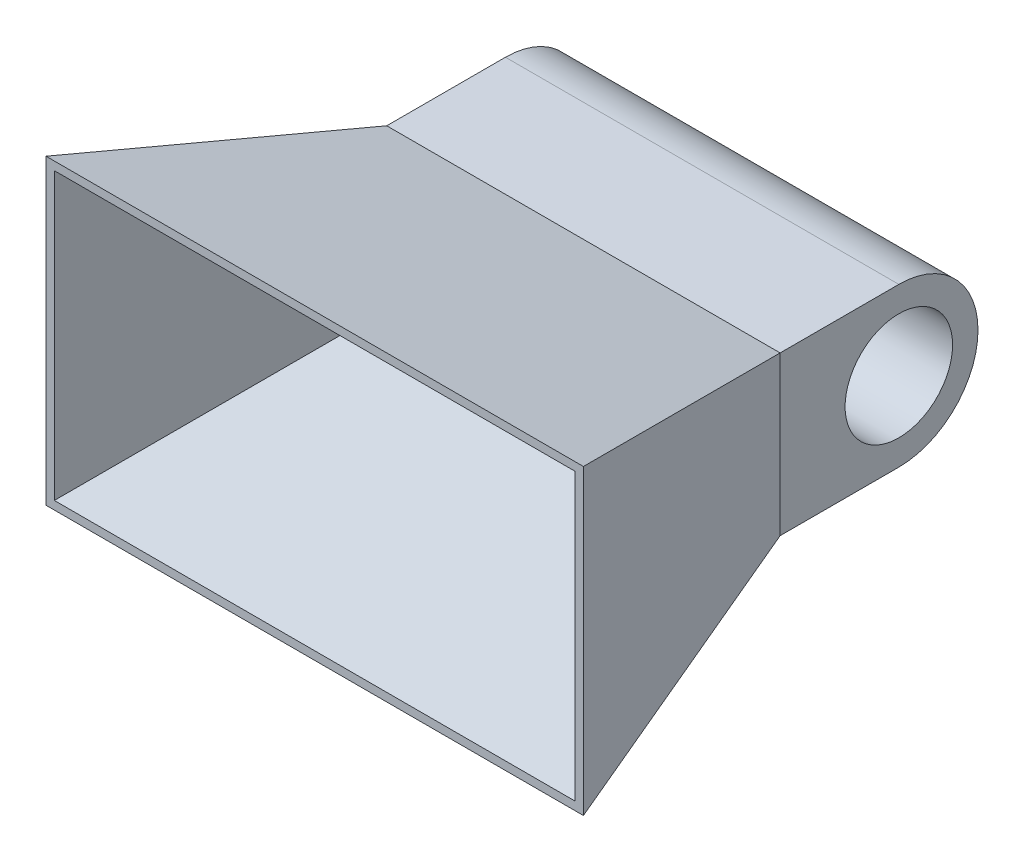
ISO-10303-21;
HEADER;
FILE_DESCRIPTION(('STEP AP214'),'2;1');
FILE_NAME('part.step','',(''),(''),'','','');
FILE_SCHEMA(('AUTOMOTIVE_DESIGN { 1 0 10303 214 1 1 1 1 }'));
ENDSEC;
DATA;
#1=APPLICATION_CONTEXT('core data for automotive mechanical design processes');
#2=APPLICATION_PROTOCOL_DEFINITION('international standard','automotive_design',2000,#1);
#3=PRODUCT_CONTEXT('',#1,'mechanical');
#4=PRODUCT('Part','Part','',(#3));
#5=PRODUCT_RELATED_PRODUCT_CATEGORY('part','',(#4));
#6=PRODUCT_DEFINITION_FORMATION('','',#4);
#7=PRODUCT_DEFINITION_CONTEXT('part definition',#1,'design');
#8=PRODUCT_DEFINITION('design','',#6,#7);
#9=PRODUCT_DEFINITION_SHAPE('','',#8);
#10=(LENGTH_UNIT() NAMED_UNIT(*) SI_UNIT(.MILLI.,.METRE.));
#11=(NAMED_UNIT(*) PLANE_ANGLE_UNIT() SI_UNIT($,.RADIAN.));
#12=(NAMED_UNIT(*) SI_UNIT($,.STERADIAN.) SOLID_ANGLE_UNIT());
#13=UNCERTAINTY_MEASURE_WITH_UNIT(LENGTH_MEASURE(1.E-05),#10,'distance_accuracy_value','');
#14=(GEOMETRIC_REPRESENTATION_CONTEXT(3) GLOBAL_UNCERTAINTY_ASSIGNED_CONTEXT((#13)) GLOBAL_UNIT_ASSIGNED_CONTEXT((#10,
#11,#12)) REPRESENTATION_CONTEXT('',''));
#15=CARTESIAN_POINT('',(0.,0.,0.));
#16=DIRECTION('',(0.,0.,1.));
#17=DIRECTION('',(1.,0.,0.));
#18=AXIS2_PLACEMENT_3D('',#15,#16,#17);
#19=CARTESIAN_POINT('',(100.,56.25,0.));
#20=DIRECTION('',(0.965925826289068,0.,-0.258819045102521));
#21=DIRECTION('',(-0.258819045102521,0.,-0.965925826289068));
#22=AXIS2_PLACEMENT_3D('',#19,#20,#21);
#23=PLANE('',#22);
#24=DIRECTION('',(0.,1.,0.));
#25=VECTOR('',#24,1.);
#26=CARTESIAN_POINT('',(100.,56.25,0.));
#27=LINE('',#26,#25);
#28=CARTESIAN_POINT('',(100.,-56.25,0.));
#29=VERTEX_POINT('',#28);
#30=CARTESIAN_POINT('',(100.,56.25,0.));
#31=VERTEX_POINT('',#30);
#32=EDGE_CURVE('E147',#29,#31,#27,.T.);
#33=ORIENTED_EDGE('',*,*,#32,.F.);
#34=DIRECTION('',(0.250562807085732,-0.250562807085732,0.935113126531029));
#35=VECTOR('',#34,1.);
#36=CARTESIAN_POINT('',(87.4436559410637,-43.6936559410636,-46.860913985266));
#37=LINE('',#36,#35);
#38=CARTESIAN_POINT('',(73.2050807568877,-29.4550807568877,-100.));
#39=VERTEX_POINT('',#38);
#40=EDGE_CURVE('E11',#39,#29,#37,.T.);
#41=ORIENTED_EDGE('',*,*,#40,.F.);
#42=DIRECTION('',(0.,1.,0.));
#43=VECTOR('',#42,1.);
#44=CARTESIAN_POINT('',(73.2050807568877,0.,-100.));
#45=LINE('',#44,#43);
#46=CARTESIAN_POINT('',(73.2050807568877,29.4550807568877,-100.));
#47=VERTEX_POINT('',#46);
#48=EDGE_CURVE('E185',#39,#47,#45,.T.);
#49=ORIENTED_EDGE('',*,*,#48,.T.);
#50=DIRECTION('',(0.250562807085732,0.250562807085732,0.935113126531029));
#51=VECTOR('',#50,1.);
#52=CARTESIAN_POINT('',(100.,56.25,0.));
#53=LINE('',#52,#51);
#54=EDGE_CURVE('E187',#47,#31,#53,.T.);
#55=ORIENTED_EDGE('',*,*,#54,.T.);
#56=EDGE_LOOP('',(#33,#41,#49,#55));
#57=FACE_BOUND('',#56,.T.);
#58=ADVANCED_FACE('F36',(#57),#23,.T.);
#59=CARTESIAN_POINT('',(-100.,-56.25,0.));
#60=DIRECTION('',(0.,-0.965925826289068,-0.258819045102521));
#61=DIRECTION('',(0.,0.258819045102521,-0.965925826289068));
#62=AXIS2_PLACEMENT_3D('',#59,#60,#61);
#63=PLANE('',#62);
#64=DIRECTION('',(1.,0.,0.));
#65=VECTOR('',#64,1.);
#66=CARTESIAN_POINT('',(-100.,-56.25,0.));
#67=LINE('',#66,#65);
#68=CARTESIAN_POINT('',(-100.,-56.25,0.));
#69=VERTEX_POINT('',#68);
#70=EDGE_CURVE('E183',#69,#29,#67,.T.);
#71=ORIENTED_EDGE('',*,*,#70,.F.);
#72=DIRECTION('',(-0.250562807085732,-0.250562807085732,0.935113126531029));
#73=VECTOR('',#72,1.);
#74=CARTESIAN_POINT('',(-92.9370564668483,-49.1870564668483,-26.3592641167121));
#75=LINE('',#74,#73);
#76=CARTESIAN_POINT('',(-73.2050807568877,-29.4550807568877,-100.));
#77=VERTEX_POINT('',#76);
#78=EDGE_CURVE('E45',#77,#69,#75,.T.);
#79=ORIENTED_EDGE('',*,*,#78,.F.);
#80=DIRECTION('',(1.,0.,0.));
#81=VECTOR('',#80,1.);
#82=CARTESIAN_POINT('',(0.,-29.4550807568877,-100.));
#83=LINE('',#82,#81);
#84=EDGE_CURVE('E132',#77,#39,#83,.T.);
#85=ORIENTED_EDGE('',*,*,#84,.T.);
#86=ORIENTED_EDGE('',*,*,#40,.T.);
#87=EDGE_LOOP('',(#71,#79,#85,#86));
#88=FACE_BOUND('',#87,.T.);
#89=ADVANCED_FACE('F38',(#88),#63,.T.);
#90=CARTESIAN_POINT('',(-100.,56.25,0.));
#91=DIRECTION('',(-0.965925826289068,0.,-0.258819045102521));
#92=DIRECTION('',(-0.258819045102521,0.,0.965925826289068));
#93=AXIS2_PLACEMENT_3D('',#90,#91,#92);
#94=PLANE('',#93);
#95=DIRECTION('',(0.,-1.,0.));
#96=VECTOR('',#95,1.);
#97=CARTESIAN_POINT('',(-100.,56.25,0.));
#98=LINE('',#97,#96);
#99=CARTESIAN_POINT('',(-100.,56.25,0.));
#100=VERTEX_POINT('',#99);
#101=EDGE_CURVE('E180',#100,#69,#98,.T.);
#102=ORIENTED_EDGE('',*,*,#101,.F.);
#103=DIRECTION('',(-0.250562807085732,0.250562807085732,0.935113126531029));
#104=VECTOR('',#103,1.);
#105=CARTESIAN_POINT('',(-100.,56.25,0.));
#106=LINE('',#105,#104);
#107=CARTESIAN_POINT('',(-73.2050807568877,29.4550807568877,-100.));
#108=VERTEX_POINT('',#107);
#109=EDGE_CURVE('E189',#108,#100,#106,.T.);
#110=ORIENTED_EDGE('',*,*,#109,.F.);
#111=DIRECTION('',(0.,-1.,0.));
#112=VECTOR('',#111,1.);
#113=CARTESIAN_POINT('',(-73.2050807568877,0.,-100.));
#114=LINE('',#113,#112);
#115=EDGE_CURVE('E194',#108,#77,#114,.T.);
#116=ORIENTED_EDGE('',*,*,#115,.T.);
#117=ORIENTED_EDGE('',*,*,#78,.T.);
#118=EDGE_LOOP('',(#102,#110,#116,#117));
#119=FACE_BOUND('',#118,.T.);
#120=ADVANCED_FACE('F239',(#119),#94,.T.);
#121=CARTESIAN_POINT('',(-100.,56.25,0.));
#122=DIRECTION('',(0.,0.965925826289068,-0.258819045102521));
#123=DIRECTION('',(0.,0.258819045102521,0.965925826289068));
#124=AXIS2_PLACEMENT_3D('',#121,#122,#123);
#125=PLANE('',#124);
#126=DIRECTION('',(-1.,0.,0.));
#127=VECTOR('',#126,1.);
#128=CARTESIAN_POINT('',(-100.,56.25,0.));
#129=LINE('',#128,#127);
#130=EDGE_CURVE('E177',#31,#100,#129,.T.);
#131=ORIENTED_EDGE('',*,*,#130,.F.);
#132=ORIENTED_EDGE('',*,*,#54,.F.);
#133=DIRECTION('',(-1.,0.,0.));
#134=VECTOR('',#133,1.);
#135=CARTESIAN_POINT('',(0.,29.4550807568877,-100.));
#136=LINE('',#135,#134);
#137=EDGE_CURVE('E40',#47,#108,#136,.T.);
#138=ORIENTED_EDGE('',*,*,#137,.T.);
#139=ORIENTED_EDGE('',*,*,#109,.T.);
#140=EDGE_LOOP('',(#131,#132,#138,#139));
#141=FACE_BOUND('',#140,.T.);
#142=ADVANCED_FACE('F202',(#141),#125,.T.);
#143=CARTESIAN_POINT('',(0.,0.,0.));
#144=DIRECTION('',(0.,0.,1.));
#145=DIRECTION('',(1.,0.,0.));
#146=AXIS2_PLACEMENT_3D('',#143,#144,#145);
#147=PLANE('',#146);
#148=DIRECTION('',(0.,1.,0.));
#149=VECTOR('',#148,1.);
#150=CARTESIAN_POINT('',(96.8941714587698,0.,0.));
#151=LINE('',#150,#149);
#152=CARTESIAN_POINT('',(96.8941714587698,-53.1441714587698,0.));
#153=VERTEX_POINT('',#152);
#154=CARTESIAN_POINT('',(96.8941714587697,53.1441714587697,0.));
#155=VERTEX_POINT('',#154);
#156=EDGE_CURVE('E142',#153,#155,#151,.T.);
#157=ORIENTED_EDGE('',*,*,#156,.F.);
#158=DIRECTION('',(1.,0.,0.));
#159=VECTOR('',#158,1.);
#160=CARTESIAN_POINT('',(0.,-53.1441714587698,0.));
#161=LINE('',#160,#159);
#162=CARTESIAN_POINT('',(-96.8941714587698,-53.1441714587698,0.));
#163=VERTEX_POINT('',#162);
#164=EDGE_CURVE('E153',#163,#153,#161,.T.);
#165=ORIENTED_EDGE('',*,*,#164,.F.);
#166=DIRECTION('',(0.,-1.,0.));
#167=VECTOR('',#166,1.);
#168=CARTESIAN_POINT('',(-96.8941714587698,0.,0.));
#169=LINE('',#168,#167);
#170=CARTESIAN_POINT('',(-96.8941714587698,53.1441714587697,0.));
#171=VERTEX_POINT('',#170);
#172=EDGE_CURVE('E53',#171,#163,#169,.T.);
#173=ORIENTED_EDGE('',*,*,#172,.F.);
#174=DIRECTION('',(-1.,0.,0.));
#175=VECTOR('',#174,1.);
#176=CARTESIAN_POINT('',(0.,53.1441714587697,0.));
#177=LINE('',#176,#175);
#178=EDGE_CURVE('E169',#155,#171,#177,.T.);
#179=ORIENTED_EDGE('',*,*,#178,.F.);
#180=EDGE_LOOP('',(#157,#165,#173,#179));
#181=FACE_BOUND('',#180,.T.);
#182=ORIENTED_EDGE('',*,*,#32,.T.);
#183=ORIENTED_EDGE('',*,*,#130,.T.);
#184=ORIENTED_EDGE('',*,*,#101,.T.);
#185=ORIENTED_EDGE('',*,*,#70,.T.);
#186=EDGE_LOOP('',(#182,#183,#184,#185));
#187=FACE_BOUND('',#186,.T.);
#188=ADVANCED_FACE('F244',(#181,#187),#147,.T.);
#189=CARTESIAN_POINT('',(97.1022225211328,56.25,0.776457135307564));
#190=DIRECTION('',(0.965925826289068,0.,-0.258819045102521));
#191=DIRECTION('',(-0.258819045102521,0.,-0.965925826289068));
#192=AXIS2_PLACEMENT_3D('',#189,#190,#191);
#193=PLANE('',#192);
#194=ORIENTED_EDGE('',*,*,#156,.T.);
#195=DIRECTION('',(0.250562807085732,0.250562807085732,0.935113126531029));
#196=VECTOR('',#195,1.);
#197=CARTESIAN_POINT('',(97.2841499762873,53.5341499762873,1.45541964123575));
#198=LINE('',#197,#196);
#199=CARTESIAN_POINT('',(70.9030997929508,27.1530997929508,-97.));
#200=VERTEX_POINT('',#199);
#201=EDGE_CURVE('E154',#200,#155,#198,.T.);
#202=ORIENTED_EDGE('',*,*,#201,.F.);
#203=DIRECTION('',(0.,1.,0.));
#204=VECTOR('',#203,1.);
#205=CARTESIAN_POINT('',(70.9030997929508,0.,-97.));
#206=LINE('',#205,#204);
#207=CARTESIAN_POINT('',(70.9030997929508,-27.1530997929508,-97.));
#208=VERTEX_POINT('',#207);
#209=EDGE_CURVE('E149',#208,#200,#206,.T.);
#210=ORIENTED_EDGE('',*,*,#209,.F.);
#211=DIRECTION('',(0.250562807085732,-0.250562807085732,0.935113126531029));
#212=VECTOR('',#211,1.);
#213=CARTESIAN_POINT('',(84.7278059173509,-40.9778059173509,-45.4054943440303));
#214=LINE('',#213,#212);
#215=EDGE_CURVE('E145',#208,#153,#214,.T.);
#216=ORIENTED_EDGE('',*,*,#215,.T.);
#217=EDGE_LOOP('',(#194,#202,#210,#216));
#218=FACE_BOUND('',#217,.T.);
#219=ADVANCED_FACE('F253',(#218),#193,.F.);
#220=CARTESIAN_POINT('',(-100.,-53.3522225211328,0.776457135307564));
#221=DIRECTION('',(0.,-0.965925826289068,-0.258819045102521));
#222=DIRECTION('',(0.,0.258819045102521,-0.965925826289068));
#223=AXIS2_PLACEMENT_3D('',#220,#221,#222);
#224=PLANE('',#223);
#225=ORIENTED_EDGE('',*,*,#164,.T.);
#226=ORIENTED_EDGE('',*,*,#215,.F.);
#227=DIRECTION('',(1.,0.,0.));
#228=VECTOR('',#227,1.);
#229=CARTESIAN_POINT('',(0.,-27.1530997929508,-97.));
#230=LINE('',#229,#228);
#231=CARTESIAN_POINT('',(-70.9030997929508,-27.1530997929508,-97.));
#232=VERTEX_POINT('',#231);
#233=EDGE_CURVE('E157',#232,#208,#230,.T.);
#234=ORIENTED_EDGE('',*,*,#233,.F.);
#235=DIRECTION('',(-0.250562807085732,-0.250562807085732,0.935113126531029));
#236=VECTOR('',#235,1.);
#237=CARTESIAN_POINT('',(-90.2212064431356,-46.4712064431356,-24.9038444754764));
#238=LINE('',#237,#236);
#239=EDGE_CURVE('E148',#232,#163,#238,.T.);
#240=ORIENTED_EDGE('',*,*,#239,.T.);
#241=EDGE_LOOP('',(#225,#226,#234,#240));
#242=FACE_BOUND('',#241,.T.);
#243=ADVANCED_FACE('F258',(#242),#224,.F.);
#244=CARTESIAN_POINT('',(-97.1022225211328,56.25,0.776457135307564));
#245=DIRECTION('',(-0.965925826289068,0.,-0.258819045102521));
#246=DIRECTION('',(-0.258819045102521,0.,0.965925826289068));
#247=AXIS2_PLACEMENT_3D('',#244,#245,#246);
#248=PLANE('',#247);
#249=ORIENTED_EDGE('',*,*,#172,.T.);
#250=ORIENTED_EDGE('',*,*,#239,.F.);
#251=DIRECTION('',(0.,-1.,0.));
#252=VECTOR('',#251,1.);
#253=CARTESIAN_POINT('',(-70.9030997929508,0.,-97.));
#254=LINE('',#253,#252);
#255=CARTESIAN_POINT('',(-70.9030997929508,27.1530997929508,-97.));
#256=VERTEX_POINT('',#255);
#257=EDGE_CURVE('E161',#256,#232,#254,.T.);
#258=ORIENTED_EDGE('',*,*,#257,.F.);
#259=DIRECTION('',(-0.250562807085732,0.250562807085732,0.935113126531029));
#260=VECTOR('',#259,1.);
#261=CARTESIAN_POINT('',(-97.2841499762873,53.5341499762873,1.45541964123575));
#262=LINE('',#261,#260);
#263=EDGE_CURVE('E156',#256,#171,#262,.T.);
#264=ORIENTED_EDGE('',*,*,#263,.T.);
#265=EDGE_LOOP('',(#249,#250,#258,#264));
#266=FACE_BOUND('',#265,.T.);
#267=ADVANCED_FACE('F269',(#266),#248,.F.);
#268=CARTESIAN_POINT('',(-100.,53.3522225211328,0.776457135307564));
#269=DIRECTION('',(0.,0.965925826289068,-0.258819045102521));
#270=DIRECTION('',(0.,0.258819045102521,0.965925826289068));
#271=AXIS2_PLACEMENT_3D('',#268,#269,#270);
#272=PLANE('',#271);
#273=ORIENTED_EDGE('',*,*,#178,.T.);
#274=ORIENTED_EDGE('',*,*,#263,.F.);
#275=DIRECTION('',(-1.,0.,0.));
#276=VECTOR('',#275,1.);
#277=CARTESIAN_POINT('',(0.,27.1530997929508,-97.));
#278=LINE('',#277,#276);
#279=EDGE_CURVE('E152',#200,#256,#278,.T.);
#280=ORIENTED_EDGE('',*,*,#279,.F.);
#281=ORIENTED_EDGE('',*,*,#201,.T.);
#282=EDGE_LOOP('',(#273,#274,#280,#281));
#283=FACE_BOUND('',#282,.T.);
#284=ADVANCED_FACE('F272',(#283),#272,.F.);
#285=CARTESIAN_POINT('',(0.,0.,-97.));
#286=DIRECTION('',(0.,0.,1.));
#287=DIRECTION('',(1.,0.,0.));
#288=AXIS2_PLACEMENT_3D('',#285,#286,#287);
#289=PLANE('',#288);
#290=ORIENTED_EDGE('',*,*,#209,.T.);
#291=ORIENTED_EDGE('',*,*,#279,.T.);
#292=ORIENTED_EDGE('',*,*,#257,.T.);
#293=ORIENTED_EDGE('',*,*,#233,.T.);
#294=EDGE_LOOP('',(#290,#291,#292,#293));
#295=FACE_BOUND('',#294,.T.);
#296=ADVANCED_FACE('F228',(#295),#289,.T.);
#297=CARTESIAN_POINT('',(-73.2050807568877,0.,0.));
#298=DIRECTION('',(-1.,0.,0.));
#299=DIRECTION('',(0.,0.,1.));
#300=AXIS2_PLACEMENT_3D('',#297,#298,#299);
#301=PLANE('',#300);
#302=CARTESIAN_POINT('',(-73.2050807568877,0.,-144.182621135331));
#303=DIRECTION('',(-1.,0.,0.));
#304=DIRECTION('',(0.,0.,1.));
#305=AXIS2_PLACEMENT_3D('',#302,#303,#304);
#306=CIRCLE('',#305,20.);
#307=CARTESIAN_POINT('',(-73.2050807568877,0.,-124.182621135331));
#308=VERTEX_POINT('',#307);
#309=EDGE_CURVE('E210',#308,#308,#306,.F.);
#310=ORIENTED_EDGE('',*,*,#309,.T.);
#311=EDGE_LOOP('',(#310));
#312=FACE_BOUND('',#311,.T.);
#313=ORIENTED_EDGE('',*,*,#115,.F.);
#314=DIRECTION('',(0.,0.,1.));
#315=VECTOR('',#314,1.);
#316=CARTESIAN_POINT('',(-73.2050807568877,29.4550807568877,-100.));
#317=LINE('',#316,#315);
#318=CARTESIAN_POINT('',(-73.2050807568877,29.4550807568877,-144.182621135331));
#319=VERTEX_POINT('',#318);
#320=EDGE_CURVE('E61',#319,#108,#317,.T.);
#321=ORIENTED_EDGE('',*,*,#320,.F.);
#322=CARTESIAN_POINT('',(-73.2050807568877,0.,-144.182621135331));
#323=DIRECTION('',(-1.,0.,0.));
#324=DIRECTION('',(0.,0.,1.));
#325=AXIS2_PLACEMENT_3D('',#322,#323,#324);
#326=CIRCLE('',#325,29.4550807568877);
#327=CARTESIAN_POINT('',(-73.2050807568877,-29.4550807568877,-144.182621135331));
#328=VERTEX_POINT('',#327);
#329=EDGE_CURVE('E113',#328,#319,#326,.F.);
#330=ORIENTED_EDGE('',*,*,#329,.F.);
#331=DIRECTION('',(0.,0.,-1.));
#332=VECTOR('',#331,1.);
#333=CARTESIAN_POINT('',(-73.2050807568877,-29.4550807568877,-100.));
#334=LINE('',#333,#332);
#335=EDGE_CURVE('E117',#77,#328,#334,.T.);
#336=ORIENTED_EDGE('',*,*,#335,.F.);
#337=EDGE_LOOP('',(#313,#321,#330,#336));
#338=FACE_BOUND('',#337,.T.);
#339=ADVANCED_FACE('F115',(#312,#338),#301,.T.);
#340=CARTESIAN_POINT('',(73.2050807568877,0.,-144.182621135331));
#341=DIRECTION('',(1.,0.,0.));
#342=DIRECTION('',(0.,0.,-1.));
#343=AXIS2_PLACEMENT_3D('',#340,#341,#342);
#344=PLANE('',#343);
#345=CARTESIAN_POINT('',(73.2050807568877,0.,-144.182621135331));
#346=DIRECTION('',(1.,0.,0.));
#347=DIRECTION('',(0.,0.,-1.));
#348=AXIS2_PLACEMENT_3D('',#345,#346,#347);
#349=CIRCLE('',#348,20.);
#350=CARTESIAN_POINT('',(73.2050807568877,0.,-164.182621135331));
#351=VERTEX_POINT('',#350);
#352=EDGE_CURVE('E214',#351,#351,#349,.T.);
#353=ORIENTED_EDGE('',*,*,#352,.F.);
#354=EDGE_LOOP('',(#353));
#355=FACE_BOUND('',#354,.T.);
#356=ORIENTED_EDGE('',*,*,#48,.F.);
#357=DIRECTION('',(0.,0.,-1.));
#358=VECTOR('',#357,1.);
#359=CARTESIAN_POINT('',(73.2050807568877,-29.4550807568877,-100.));
#360=LINE('',#359,#358);
#361=CARTESIAN_POINT('',(73.2050807568877,-29.4550807568877,-144.182621135331));
#362=VERTEX_POINT('',#361);
#363=EDGE_CURVE('E140',#39,#362,#360,.T.);
#364=ORIENTED_EDGE('',*,*,#363,.T.);
#365=CARTESIAN_POINT('',(73.2050807568877,0.,-144.182621135331));
#366=DIRECTION('',(1.,0.,0.));
#367=DIRECTION('',(0.,0.,-1.));
#368=AXIS2_PLACEMENT_3D('',#365,#366,#367);
#369=CIRCLE('',#368,29.4550807568877);
#370=CARTESIAN_POINT('',(73.2050807568877,29.4550807568877,-144.182621135331));
#371=VERTEX_POINT('',#370);
#372=EDGE_CURVE('E126',#362,#371,#369,.T.);
#373=ORIENTED_EDGE('',*,*,#372,.T.);
#374=DIRECTION('',(0.,0.,1.));
#375=VECTOR('',#374,1.);
#376=CARTESIAN_POINT('',(73.2050807568877,29.4550807568877,-100.));
#377=LINE('',#376,#375);
#378=EDGE_CURVE('E134',#371,#47,#377,.T.);
#379=ORIENTED_EDGE('',*,*,#378,.T.);
#380=EDGE_LOOP('',(#356,#364,#373,#379));
#381=FACE_BOUND('',#380,.T.);
#382=ADVANCED_FACE('F208',(#355,#381),#344,.T.);
#383=CARTESIAN_POINT('',(-167.507351511872,-29.4550807568877,-100.));
#384=DIRECTION('',(0.,-1.,0.));
#385=DIRECTION('',(0.,0.,-1.));
#386=AXIS2_PLACEMENT_3D('',#383,#384,#385);
#387=PLANE('',#386);
#388=ORIENTED_EDGE('',*,*,#84,.F.);
#389=ORIENTED_EDGE('',*,*,#335,.T.);
#390=DIRECTION('',(1.,0.,0.));
#391=VECTOR('',#390,1.);
#392=CARTESIAN_POINT('',(-167.507351511872,-29.4550807568877,-144.182621135331));
#393=LINE('',#392,#391);
#394=EDGE_CURVE('E121',#328,#362,#393,.T.);
#395=ORIENTED_EDGE('',*,*,#394,.T.);
#396=ORIENTED_EDGE('',*,*,#363,.F.);
#397=EDGE_LOOP('',(#388,#389,#395,#396));
#398=FACE_BOUND('',#397,.T.);
#399=ADVANCED_FACE('F130',(#398),#387,.T.);
#400=CARTESIAN_POINT('',(-167.507351511872,0.,-144.182621135331));
#401=DIRECTION('',(1.,0.,0.));
#402=DIRECTION('',(0.,0.,-1.));
#403=AXIS2_PLACEMENT_3D('',#400,#401,#402);
#404=CYLINDRICAL_SURFACE('',#403,29.4550807568877);
#405=ORIENTED_EDGE('',*,*,#394,.F.);
#406=ORIENTED_EDGE('',*,*,#329,.T.);
#407=DIRECTION('',(1.,0.,0.));
#408=VECTOR('',#407,1.);
#409=CARTESIAN_POINT('',(-167.507351511872,29.4550807568877,-144.182621135331));
#410=LINE('',#409,#408);
#411=EDGE_CURVE('E120',#319,#371,#410,.T.);
#412=ORIENTED_EDGE('',*,*,#411,.T.);
#413=ORIENTED_EDGE('',*,*,#372,.F.);
#414=EDGE_LOOP('',(#405,#406,#412,#413));
#415=FACE_BOUND('',#414,.T.);
#416=ADVANCED_FACE('F124',(#415),#404,.T.);
#417=CARTESIAN_POINT('',(-167.507351511872,29.4550807568877,-100.));
#418=DIRECTION('',(0.,1.,0.));
#419=DIRECTION('',(0.,0.,1.));
#420=AXIS2_PLACEMENT_3D('',#417,#418,#419);
#421=PLANE('',#420);
#422=ORIENTED_EDGE('',*,*,#411,.F.);
#423=ORIENTED_EDGE('',*,*,#320,.T.);
#424=ORIENTED_EDGE('',*,*,#137,.F.);
#425=ORIENTED_EDGE('',*,*,#378,.F.);
#426=EDGE_LOOP('',(#422,#423,#424,#425));
#427=FACE_BOUND('',#426,.T.);
#428=ADVANCED_FACE('F205',(#427),#421,.T.);
#429=CARTESIAN_POINT('',(-129.773623251811,0.,-144.182621135331));
#430=DIRECTION('',(1.,0.,0.));
#431=DIRECTION('',(0.,0.,-1.));
#432=AXIS2_PLACEMENT_3D('',#429,#430,#431);
#433=CYLINDRICAL_SURFACE('',#432,20.);
#434=ORIENTED_EDGE('',*,*,#352,.T.);
#435=EDGE_LOOP('',(#434));
#436=FACE_BOUND('',#435,.T.);
#437=ORIENTED_EDGE('',*,*,#309,.F.);
#438=EDGE_LOOP('',(#437));
#439=FACE_BOUND('',#438,.T.);
#440=ADVANCED_FACE('F218',(#436,#439),#433,.F.);
#441=CLOSED_SHELL('',(#58,#89,#120,#142,#188,#219,#243,#267,#284,#296,#339,#382,#399,#416,#428,#440));
#442=MANIFOLD_SOLID_BREP('B2',#441);
#443=ADVANCED_BREP_SHAPE_REPRESENTATION('',(#18,#442),#14);
#444=SHAPE_DEFINITION_REPRESENTATION(#9,#443);
ENDSEC;
END-ISO-10303-21;
